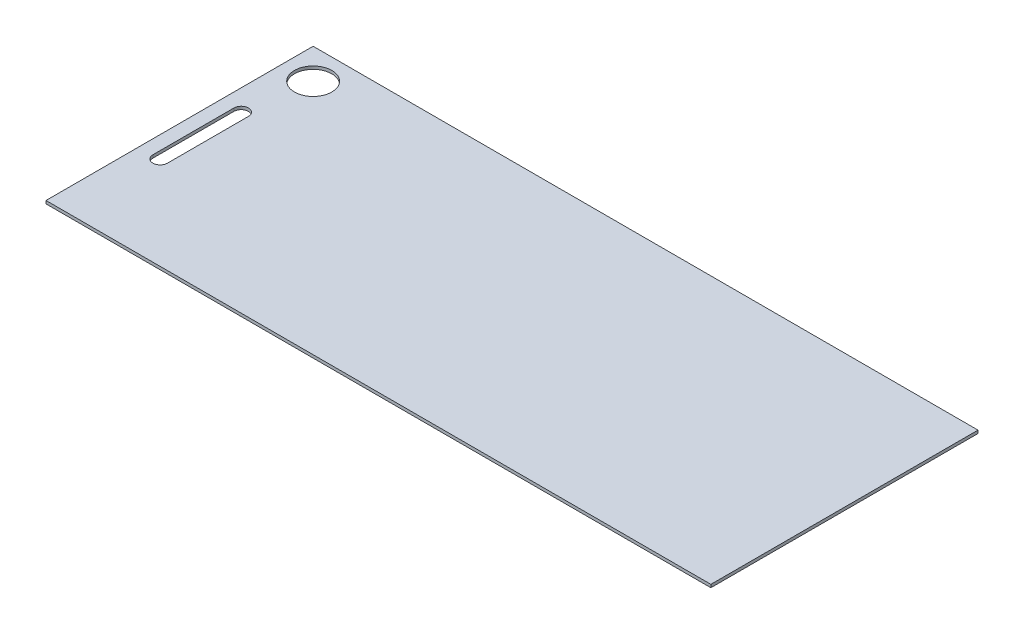
ISO-10303-21;
HEADER;
FILE_DESCRIPTION(('STEP AP214'),'2;1');
FILE_NAME('part.step','',(''),(''),'','','');
FILE_SCHEMA(('AUTOMOTIVE_DESIGN { 1 0 10303 214 1 1 1 1 }'));
ENDSEC;
DATA;
#1=APPLICATION_CONTEXT('core data for automotive mechanical design processes');
#2=APPLICATION_PROTOCOL_DEFINITION('international standard','automotive_design',2000,#1);
#3=PRODUCT_CONTEXT('',#1,'mechanical');
#4=PRODUCT('Part','Part','',(#3));
#5=PRODUCT_RELATED_PRODUCT_CATEGORY('part','',(#4));
#6=PRODUCT_DEFINITION_FORMATION('','',#4);
#7=PRODUCT_DEFINITION_CONTEXT('part definition',#1,'design');
#8=PRODUCT_DEFINITION('design','',#6,#7);
#9=PRODUCT_DEFINITION_SHAPE('','',#8);
#10=(LENGTH_UNIT() NAMED_UNIT(*) SI_UNIT(.MILLI.,.METRE.));
#11=(NAMED_UNIT(*) PLANE_ANGLE_UNIT() SI_UNIT($,.RADIAN.));
#12=(NAMED_UNIT(*) SI_UNIT($,.STERADIAN.) SOLID_ANGLE_UNIT());
#13=UNCERTAINTY_MEASURE_WITH_UNIT(LENGTH_MEASURE(1.E-05),#10,'distance_accuracy_value','');
#14=(GEOMETRIC_REPRESENTATION_CONTEXT(3) GLOBAL_UNCERTAINTY_ASSIGNED_CONTEXT((#13)) GLOBAL_UNIT_ASSIGNED_CONTEXT((#10,
#11,#12)) REPRESENTATION_CONTEXT('',''));
#15=CARTESIAN_POINT('',(0.,0.,0.));
#16=DIRECTION('',(0.,0.,1.));
#17=DIRECTION('',(1.,0.,0.));
#18=AXIS2_PLACEMENT_3D('',#15,#16,#17);
#19=CARTESIAN_POINT('',(853.44,7.62,-342.9));
#20=DIRECTION('',(-1.,0.,0.));
#21=DIRECTION('',(0.,0.,1.));
#22=AXIS2_PLACEMENT_3D('',#19,#20,#21);
#23=PLANE('',#22);
#24=DIRECTION('',(0.,0.,-1.));
#25=VECTOR('',#24,1.);
#26=CARTESIAN_POINT('',(853.44,0.,-342.9));
#27=LINE('',#26,#25);
#28=CARTESIAN_POINT('',(853.44,0.,342.9));
#29=VERTEX_POINT('',#28);
#30=CARTESIAN_POINT('',(853.44,0.,-342.9));
#31=VERTEX_POINT('',#30);
#32=EDGE_CURVE('E148',#29,#31,#27,.T.);
#33=ORIENTED_EDGE('',*,*,#32,.T.);
#34=DIRECTION('',(0.,-1.,0.));
#35=VECTOR('',#34,1.);
#36=CARTESIAN_POINT('',(853.44,7.62,-342.9));
#37=LINE('',#36,#35);
#38=CARTESIAN_POINT('',(853.44,7.62,-342.9));
#39=VERTEX_POINT('',#38);
#40=EDGE_CURVE('E11',#39,#31,#37,.T.);
#41=ORIENTED_EDGE('',*,*,#40,.F.);
#42=DIRECTION('',(0.,0.,-1.));
#43=VECTOR('',#42,1.);
#44=CARTESIAN_POINT('',(853.44,7.62,-342.9));
#45=LINE('',#44,#43);
#46=CARTESIAN_POINT('',(853.44,7.62,342.9));
#47=VERTEX_POINT('',#46);
#48=EDGE_CURVE('E161',#47,#39,#45,.T.);
#49=ORIENTED_EDGE('',*,*,#48,.F.);
#50=DIRECTION('',(0.,-1.,0.));
#51=VECTOR('',#50,1.);
#52=CARTESIAN_POINT('',(853.44,7.62,342.9));
#53=LINE('',#52,#51);
#54=EDGE_CURVE('E175',#47,#29,#53,.T.);
#55=ORIENTED_EDGE('',*,*,#54,.T.);
#56=EDGE_LOOP('',(#33,#41,#49,#55));
#57=FACE_BOUND('',#56,.T.);
#58=ADVANCED_FACE('F39',(#57),#23,.F.);
#59=CARTESIAN_POINT('',(-853.44,7.62,-342.9));
#60=DIRECTION('',(0.,0.,1.));
#61=DIRECTION('',(1.,0.,0.));
#62=AXIS2_PLACEMENT_3D('',#59,#60,#61);
#63=PLANE('',#62);
#64=DIRECTION('',(-1.,0.,0.));
#65=VECTOR('',#64,1.);
#66=CARTESIAN_POINT('',(-853.44,0.,-342.9));
#67=LINE('',#66,#65);
#68=CARTESIAN_POINT('',(-853.44,0.,-342.9));
#69=VERTEX_POINT('',#68);
#70=EDGE_CURVE('E179',#31,#69,#67,.T.);
#71=ORIENTED_EDGE('',*,*,#70,.T.);
#72=DIRECTION('',(0.,-1.,0.));
#73=VECTOR('',#72,1.);
#74=CARTESIAN_POINT('',(-853.44,7.62,-342.9));
#75=LINE('',#74,#73);
#76=CARTESIAN_POINT('',(-853.44,7.62,-342.9));
#77=VERTEX_POINT('',#76);
#78=EDGE_CURVE('E47',#77,#69,#75,.T.);
#79=ORIENTED_EDGE('',*,*,#78,.F.);
#80=DIRECTION('',(-1.,0.,0.));
#81=VECTOR('',#80,1.);
#82=CARTESIAN_POINT('',(-853.44,7.62,-342.9));
#83=LINE('',#82,#81);
#84=EDGE_CURVE('E165',#39,#77,#83,.T.);
#85=ORIENTED_EDGE('',*,*,#84,.F.);
#86=ORIENTED_EDGE('',*,*,#40,.T.);
#87=EDGE_LOOP('',(#71,#79,#85,#86));
#88=FACE_BOUND('',#87,.T.);
#89=ADVANCED_FACE('F214',(#88),#63,.F.);
#90=CARTESIAN_POINT('',(-853.44,7.62,-342.9));
#91=DIRECTION('',(1.,0.,0.));
#92=DIRECTION('',(0.,0.,-1.));
#93=AXIS2_PLACEMENT_3D('',#90,#91,#92);
#94=PLANE('',#93);
#95=DIRECTION('',(0.,0.,1.));
#96=VECTOR('',#95,1.);
#97=CARTESIAN_POINT('',(-853.44,0.,-342.9));
#98=LINE('',#97,#96);
#99=CARTESIAN_POINT('',(-853.44,0.,342.9));
#100=VERTEX_POINT('',#99);
#101=EDGE_CURVE('E182',#69,#100,#98,.T.);
#102=ORIENTED_EDGE('',*,*,#101,.T.);
#103=DIRECTION('',(0.,-1.,0.));
#104=VECTOR('',#103,1.);
#105=CARTESIAN_POINT('',(-853.44,7.62,342.9));
#106=LINE('',#105,#104);
#107=CARTESIAN_POINT('',(-853.44,7.62,342.9));
#108=VERTEX_POINT('',#107);
#109=EDGE_CURVE('E190',#108,#100,#106,.T.);
#110=ORIENTED_EDGE('',*,*,#109,.F.);
#111=DIRECTION('',(0.,0.,1.));
#112=VECTOR('',#111,1.);
#113=CARTESIAN_POINT('',(-853.44,7.62,-342.9));
#114=LINE('',#113,#112);
#115=EDGE_CURVE('E169',#77,#108,#114,.T.);
#116=ORIENTED_EDGE('',*,*,#115,.F.);
#117=ORIENTED_EDGE('',*,*,#78,.T.);
#118=EDGE_LOOP('',(#102,#110,#116,#117));
#119=FACE_BOUND('',#118,.T.);
#120=ADVANCED_FACE('F199',(#119),#94,.F.);
#121=CARTESIAN_POINT('',(-853.44,7.62,342.9));
#122=DIRECTION('',(0.,0.,-1.));
#123=DIRECTION('',(-1.,0.,0.));
#124=AXIS2_PLACEMENT_3D('',#121,#122,#123);
#125=PLANE('',#124);
#126=DIRECTION('',(1.,0.,0.));
#127=VECTOR('',#126,1.);
#128=CARTESIAN_POINT('',(-853.44,0.,342.9));
#129=LINE('',#128,#127);
#130=EDGE_CURVE('E166',#100,#29,#129,.T.);
#131=ORIENTED_EDGE('',*,*,#130,.T.);
#132=ORIENTED_EDGE('',*,*,#54,.F.);
#133=DIRECTION('',(1.,0.,0.));
#134=VECTOR('',#133,1.);
#135=CARTESIAN_POINT('',(-853.44,7.62,342.9));
#136=LINE('',#135,#134);
#137=EDGE_CURVE('E172',#108,#47,#136,.T.);
#138=ORIENTED_EDGE('',*,*,#137,.F.);
#139=ORIENTED_EDGE('',*,*,#109,.T.);
#140=EDGE_LOOP('',(#131,#132,#138,#139));
#141=FACE_BOUND('',#140,.T.);
#142=ADVANCED_FACE('F207',(#141),#125,.F.);
#143=CARTESIAN_POINT('',(0.,7.62,0.));
#144=DIRECTION('',(0.,1.,0.));
#145=DIRECTION('',(0.,0.,1.));
#146=AXIS2_PLACEMENT_3D('',#143,#144,#145);
#147=PLANE('',#146);
#148=CARTESIAN_POINT('',(-799.176297549867,7.62,-103.980830334823));
#149=DIRECTION('',(0.,1.,0.));
#150=DIRECTION('',(0.,0.,1.));
#151=AXIS2_PLACEMENT_3D('',#148,#149,#150);
#152=CIRCLE('',#151,18.6825164662427);
#153=CARTESIAN_POINT('',(-780.493781083625,7.62,-103.980830334823));
#154=VERTEX_POINT('',#153);
#155=CARTESIAN_POINT('',(-817.85881401611,7.62,-103.980830334823));
#156=VERTEX_POINT('',#155);
#157=EDGE_CURVE('E54',#154,#156,#152,.T.);
#158=ORIENTED_EDGE('',*,*,#157,.F.);
#159=DIRECTION('',(0.,0.,-1.));
#160=VECTOR('',#159,1.);
#161=CARTESIAN_POINT('',(-780.493781083625,7.62,-103.980830334823));
#162=LINE('',#161,#160);
#163=CARTESIAN_POINT('',(-780.493781083625,7.62,103.980830334823));
#164=VERTEX_POINT('',#163);
#165=EDGE_CURVE('E125',#164,#154,#162,.T.);
#166=ORIENTED_EDGE('',*,*,#165,.F.);
#167=CARTESIAN_POINT('',(-799.176297549867,7.62,103.980830334823));
#168=DIRECTION('',(0.,1.,0.));
#169=DIRECTION('',(0.,0.,1.));
#170=AXIS2_PLACEMENT_3D('',#167,#168,#169);
#171=CIRCLE('',#170,18.6825164662427);
#172=CARTESIAN_POINT('',(-817.85881401611,7.62,103.980830334823));
#173=VERTEX_POINT('',#172);
#174=EDGE_CURVE('E129',#173,#164,#171,.T.);
#175=ORIENTED_EDGE('',*,*,#174,.F.);
#176=DIRECTION('',(0.,0.,1.));
#177=VECTOR('',#176,1.);
#178=CARTESIAN_POINT('',(-817.85881401611,7.62,-103.980830334823));
#179=LINE('',#178,#177);
#180=EDGE_CURVE('E138',#156,#173,#179,.T.);
#181=ORIENTED_EDGE('',*,*,#180,.F.);
#182=EDGE_LOOP('',(#158,#166,#175,#181));
#183=FACE_BOUND('',#182,.T.);
#184=CARTESIAN_POINT('',(-775.698925032474,7.62,-265.158925032474));
#185=DIRECTION('',(0.,1.,0.));
#186=DIRECTION('',(0.,0.,1.));
#187=AXIS2_PLACEMENT_3D('',#184,#185,#186);
#188=CIRCLE('',#187,48.0031239460043);
#189=CARTESIAN_POINT('',(-775.698925032474,7.62,-217.15580108647));
#190=VERTEX_POINT('',#189);
#191=EDGE_CURVE('E157',#190,#190,#188,.T.);
#192=ORIENTED_EDGE('',*,*,#191,.F.);
#193=EDGE_LOOP('',(#192));
#194=FACE_BOUND('',#193,.T.);
#195=ORIENTED_EDGE('',*,*,#48,.T.);
#196=ORIENTED_EDGE('',*,*,#84,.T.);
#197=ORIENTED_EDGE('',*,*,#115,.T.);
#198=ORIENTED_EDGE('',*,*,#137,.T.);
#199=EDGE_LOOP('',(#195,#196,#197,#198));
#200=FACE_BOUND('',#199,.T.);
#201=ADVANCED_FACE('F213',(#183,#194,#200),#147,.T.);
#202=CARTESIAN_POINT('',(0.,0.,0.));
#203=DIRECTION('',(0.,1.,0.));
#204=DIRECTION('',(0.,0.,1.));
#205=AXIS2_PLACEMENT_3D('',#202,#203,#204);
#206=PLANE('',#205);
#207=DIRECTION('',(0.,0.,-1.));
#208=VECTOR('',#207,1.);
#209=CARTESIAN_POINT('',(-780.493781083625,0.,-103.980830334823));
#210=LINE('',#209,#208);
#211=CARTESIAN_POINT('',(-780.493781083625,0.,103.980830334823));
#212=VERTEX_POINT('',#211);
#213=CARTESIAN_POINT('',(-780.493781083625,0.,-103.980830334823));
#214=VERTEX_POINT('',#213);
#215=EDGE_CURVE('E113',#212,#214,#210,.T.);
#216=ORIENTED_EDGE('',*,*,#215,.T.);
#217=CARTESIAN_POINT('',(-799.176297549867,0.,-103.980830334823));
#218=DIRECTION('',(0.,1.,0.));
#219=DIRECTION('',(0.,0.,1.));
#220=AXIS2_PLACEMENT_3D('',#217,#218,#219);
#221=CIRCLE('',#220,18.6825164662427);
#222=CARTESIAN_POINT('',(-817.85881401611,0.,-103.980830334823));
#223=VERTEX_POINT('',#222);
#224=EDGE_CURVE('E106',#214,#223,#221,.T.);
#225=ORIENTED_EDGE('',*,*,#224,.T.);
#226=DIRECTION('',(0.,0.,1.));
#227=VECTOR('',#226,1.);
#228=CARTESIAN_POINT('',(-817.85881401611,0.,-103.980830334823));
#229=LINE('',#228,#227);
#230=CARTESIAN_POINT('',(-817.85881401611,0.,103.980830334823));
#231=VERTEX_POINT('',#230);
#232=EDGE_CURVE('E116',#223,#231,#229,.T.);
#233=ORIENTED_EDGE('',*,*,#232,.T.);
#234=CARTESIAN_POINT('',(-799.176297549867,0.,103.980830334823));
#235=DIRECTION('',(0.,1.,0.));
#236=DIRECTION('',(0.,0.,1.));
#237=AXIS2_PLACEMENT_3D('',#234,#235,#236);
#238=CIRCLE('',#237,18.6825164662427);
#239=EDGE_CURVE('E62',#231,#212,#238,.T.);
#240=ORIENTED_EDGE('',*,*,#239,.T.);
#241=EDGE_LOOP('',(#216,#225,#233,#240));
#242=FACE_BOUND('',#241,.T.);
#243=CARTESIAN_POINT('',(-775.698925032474,0.,-265.158925032474));
#244=DIRECTION('',(0.,1.,0.));
#245=DIRECTION('',(0.,0.,1.));
#246=AXIS2_PLACEMENT_3D('',#243,#244,#245);
#247=CIRCLE('',#246,48.0031239460043);
#248=CARTESIAN_POINT('',(-775.698925032474,0.,-217.15580108647));
#249=VERTEX_POINT('',#248);
#250=EDGE_CURVE('E139',#249,#249,#247,.T.);
#251=ORIENTED_EDGE('',*,*,#250,.T.);
#252=EDGE_LOOP('',(#251));
#253=FACE_BOUND('',#252,.T.);
#254=ORIENTED_EDGE('',*,*,#32,.F.);
#255=ORIENTED_EDGE('',*,*,#130,.F.);
#256=ORIENTED_EDGE('',*,*,#101,.F.);
#257=ORIENTED_EDGE('',*,*,#70,.F.);
#258=EDGE_LOOP('',(#254,#255,#256,#257));
#259=FACE_BOUND('',#258,.T.);
#260=ADVANCED_FACE('F121',(#242,#253,#259),#206,.F.);
#261=CARTESIAN_POINT('',(-775.698925032474,0.,-265.158925032474));
#262=DIRECTION('',(0.,1.,0.));
#263=DIRECTION('',(0.,0.,1.));
#264=AXIS2_PLACEMENT_3D('',#261,#262,#263);
#265=CYLINDRICAL_SURFACE('',#264,48.0031239460043);
#266=ORIENTED_EDGE('',*,*,#250,.F.);
#267=EDGE_LOOP('',(#266));
#268=FACE_BOUND('',#267,.T.);
#269=ORIENTED_EDGE('',*,*,#191,.T.);
#270=EDGE_LOOP('',(#269));
#271=FACE_BOUND('',#270,.T.);
#272=ADVANCED_FACE('F226',(#268,#271),#265,.F.);
#273=CARTESIAN_POINT('',(-799.176297549867,0.,-103.980830334823));
#274=DIRECTION('',(0.,1.,0.));
#275=DIRECTION('',(0.,0.,1.));
#276=AXIS2_PLACEMENT_3D('',#273,#274,#275);
#277=CYLINDRICAL_SURFACE('',#276,18.6825164662427);
#278=ORIENTED_EDGE('',*,*,#157,.T.);
#279=DIRECTION('',(0.,1.,0.));
#280=VECTOR('',#279,1.);
#281=CARTESIAN_POINT('',(-817.85881401611,0.,-103.980830334823));
#282=LINE('',#281,#280);
#283=EDGE_CURVE('E102',#223,#156,#282,.T.);
#284=ORIENTED_EDGE('',*,*,#283,.F.);
#285=ORIENTED_EDGE('',*,*,#224,.F.);
#286=DIRECTION('',(0.,1.,0.));
#287=VECTOR('',#286,1.);
#288=CARTESIAN_POINT('',(-780.493781083625,0.,-103.980830334823));
#289=LINE('',#288,#287);
#290=EDGE_CURVE('E145',#214,#154,#289,.T.);
#291=ORIENTED_EDGE('',*,*,#290,.T.);
#292=EDGE_LOOP('',(#278,#284,#285,#291));
#293=FACE_BOUND('',#292,.T.);
#294=ADVANCED_FACE('F104',(#293),#277,.F.);
#295=CARTESIAN_POINT('',(-780.493781083625,0.,-103.980830334823));
#296=DIRECTION('',(1.,0.,0.));
#297=DIRECTION('',(0.,0.,-1.));
#298=AXIS2_PLACEMENT_3D('',#295,#296,#297);
#299=PLANE('',#298);
#300=ORIENTED_EDGE('',*,*,#165,.T.);
#301=ORIENTED_EDGE('',*,*,#290,.F.);
#302=ORIENTED_EDGE('',*,*,#215,.F.);
#303=DIRECTION('',(0.,1.,0.));
#304=VECTOR('',#303,1.);
#305=CARTESIAN_POINT('',(-780.493781083625,0.,103.980830334823));
#306=LINE('',#305,#304);
#307=EDGE_CURVE('E149',#212,#164,#306,.T.);
#308=ORIENTED_EDGE('',*,*,#307,.T.);
#309=EDGE_LOOP('',(#300,#301,#302,#308));
#310=FACE_BOUND('',#309,.T.);
#311=ADVANCED_FACE('F235',(#310),#299,.F.);
#312=CARTESIAN_POINT('',(-799.176297549867,0.,103.980830334823));
#313=DIRECTION('',(0.,1.,0.));
#314=DIRECTION('',(0.,0.,1.));
#315=AXIS2_PLACEMENT_3D('',#312,#313,#314);
#316=CYLINDRICAL_SURFACE('',#315,18.6825164662427);
#317=ORIENTED_EDGE('',*,*,#174,.T.);
#318=ORIENTED_EDGE('',*,*,#307,.F.);
#319=ORIENTED_EDGE('',*,*,#239,.F.);
#320=DIRECTION('',(0.,1.,0.));
#321=VECTOR('',#320,1.);
#322=CARTESIAN_POINT('',(-817.85881401611,0.,103.980830334823));
#323=LINE('',#322,#321);
#324=EDGE_CURVE('E112',#231,#173,#323,.T.);
#325=ORIENTED_EDGE('',*,*,#324,.T.);
#326=EDGE_LOOP('',(#317,#318,#319,#325));
#327=FACE_BOUND('',#326,.T.);
#328=ADVANCED_FACE('F238',(#327),#316,.F.);
#329=CARTESIAN_POINT('',(-817.85881401611,0.,-103.980830334823));
#330=DIRECTION('',(-1.,0.,0.));
#331=DIRECTION('',(0.,0.,1.));
#332=AXIS2_PLACEMENT_3D('',#329,#330,#331);
#333=PLANE('',#332);
#334=ORIENTED_EDGE('',*,*,#180,.T.);
#335=ORIENTED_EDGE('',*,*,#324,.F.);
#336=ORIENTED_EDGE('',*,*,#232,.F.);
#337=ORIENTED_EDGE('',*,*,#283,.T.);
#338=EDGE_LOOP('',(#334,#335,#336,#337));
#339=FACE_BOUND('',#338,.T.);
#340=ADVANCED_FACE('F117',(#339),#333,.F.);
#341=CLOSED_SHELL('',(#58,#89,#120,#142,#201,#260,#272,#294,#311,#328,#340));
#342=MANIFOLD_SOLID_BREP('B2',#341);
#343=ADVANCED_BREP_SHAPE_REPRESENTATION('',(#18,#342),#14);
#344=SHAPE_DEFINITION_REPRESENTATION(#9,#343);
ENDSEC;
END-ISO-10303-21;
